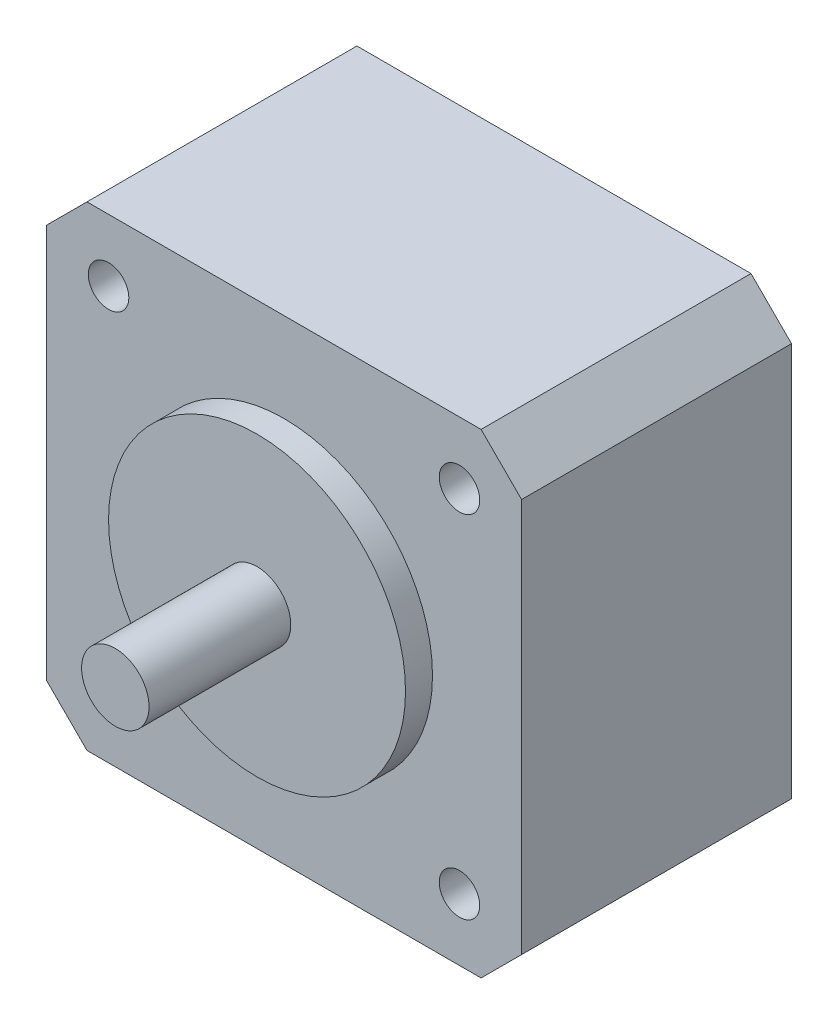
ISO-10303-21;
HEADER;
FILE_DESCRIPTION(('STEP AP214'),'2;1');
FILE_NAME('part.step','',(''),(''),'','','');
FILE_SCHEMA(('AUTOMOTIVE_DESIGN { 1 0 10303 214 1 1 1 1 }'));
ENDSEC;
DATA;
#1=APPLICATION_CONTEXT('core data for automotive mechanical design processes');
#2=APPLICATION_PROTOCOL_DEFINITION('international standard','automotive_design',2000,#1);
#3=PRODUCT_CONTEXT('',#1,'mechanical');
#4=PRODUCT('Part','Part','',(#3));
#5=PRODUCT_RELATED_PRODUCT_CATEGORY('part','',(#4));
#6=PRODUCT_DEFINITION_FORMATION('','',#4);
#7=PRODUCT_DEFINITION_CONTEXT('part definition',#1,'design');
#8=PRODUCT_DEFINITION('design','',#6,#7);
#9=PRODUCT_DEFINITION_SHAPE('','',#8);
#10=(LENGTH_UNIT() NAMED_UNIT(*) SI_UNIT(.MILLI.,.METRE.));
#11=(NAMED_UNIT(*) PLANE_ANGLE_UNIT() SI_UNIT($,.RADIAN.));
#12=(NAMED_UNIT(*) SI_UNIT($,.STERADIAN.) SOLID_ANGLE_UNIT());
#13=UNCERTAINTY_MEASURE_WITH_UNIT(LENGTH_MEASURE(1.E-05),#10,'distance_accuracy_value','');
#14=(GEOMETRIC_REPRESENTATION_CONTEXT(3) GLOBAL_UNCERTAINTY_ASSIGNED_CONTEXT((#13)) GLOBAL_UNIT_ASSIGNED_CONTEXT((#10,
#11,#12)) REPRESENTATION_CONTEXT('',''));
#15=CARTESIAN_POINT('',(0.,0.,0.));
#16=DIRECTION('',(0.,0.,1.));
#17=DIRECTION('',(1.,0.,0.));
#18=AXIS2_PLACEMENT_3D('',#15,#16,#17);
#19=CARTESIAN_POINT('',(17.6,17.6,20.));
#20=DIRECTION('',(-1.,0.,0.));
#21=DIRECTION('',(0.,0.,1.));
#22=AXIS2_PLACEMENT_3D('',#19,#20,#21);
#23=PLANE('',#22);
#24=DIRECTION('',(0.,1.,0.));
#25=VECTOR('',#24,1.);
#26=CARTESIAN_POINT('',(17.6,17.6,20.));
#27=LINE('',#26,#25);
#28=CARTESIAN_POINT('',(17.6,-14.6,20.));
#29=VERTEX_POINT('',#28);
#30=CARTESIAN_POINT('',(17.6,14.6,20.));
#31=VERTEX_POINT('',#30);
#32=EDGE_CURVE('E128',#29,#31,#27,.T.);
#33=ORIENTED_EDGE('',*,*,#32,.F.);
#34=DIRECTION('',(0.,0.,-1.));
#35=VECTOR('',#34,1.);
#36=CARTESIAN_POINT('',(17.6,-14.6,20.));
#37=LINE('',#36,#35);
#38=CARTESIAN_POINT('',(17.6,-14.6,0.));
#39=VERTEX_POINT('',#38);
#40=EDGE_CURVE('E11',#29,#39,#37,.T.);
#41=ORIENTED_EDGE('',*,*,#40,.T.);
#42=DIRECTION('',(0.,1.,0.));
#43=VECTOR('',#42,1.);
#44=CARTESIAN_POINT('',(17.6,17.6,0.));
#45=LINE('',#44,#43);
#46=CARTESIAN_POINT('',(17.6,14.6,0.));
#47=VERTEX_POINT('',#46);
#48=EDGE_CURVE('E160',#39,#47,#45,.T.);
#49=ORIENTED_EDGE('',*,*,#48,.T.);
#50=DIRECTION('',(0.,0.,1.));
#51=VECTOR('',#50,1.);
#52=CARTESIAN_POINT('',(17.6,14.6,20.));
#53=LINE('',#52,#51);
#54=EDGE_CURVE('E42',#47,#31,#53,.T.);
#55=ORIENTED_EDGE('',*,*,#54,.T.);
#56=EDGE_LOOP('',(#33,#41,#49,#55));
#57=FACE_BOUND('',#56,.T.);
#58=ADVANCED_FACE('F34',(#57),#23,.F.);
#59=CARTESIAN_POINT('',(-17.6,17.6,20.));
#60=DIRECTION('',(0.,-1.,0.));
#61=DIRECTION('',(0.,0.,-1.));
#62=AXIS2_PLACEMENT_3D('',#59,#60,#61);
#63=PLANE('',#62);
#64=DIRECTION('',(-1.,0.,0.));
#65=VECTOR('',#64,1.);
#66=CARTESIAN_POINT('',(-17.6,17.6,0.));
#67=LINE('',#66,#65);
#68=CARTESIAN_POINT('',(14.6,17.6,0.));
#69=VERTEX_POINT('',#68);
#70=CARTESIAN_POINT('',(-14.6,17.6,0.));
#71=VERTEX_POINT('',#70);
#72=EDGE_CURVE('E133',#69,#71,#67,.T.);
#73=ORIENTED_EDGE('',*,*,#72,.T.);
#74=DIRECTION('',(0.,0.,1.));
#75=VECTOR('',#74,1.);
#76=CARTESIAN_POINT('',(-14.6,17.6,20.));
#77=LINE('',#76,#75);
#78=CARTESIAN_POINT('',(-14.6,17.6,20.));
#79=VERTEX_POINT('',#78);
#80=EDGE_CURVE('E49',#71,#79,#77,.T.);
#81=ORIENTED_EDGE('',*,*,#80,.T.);
#82=DIRECTION('',(-1.,0.,0.));
#83=VECTOR('',#82,1.);
#84=CARTESIAN_POINT('',(-17.6,17.6,20.));
#85=LINE('',#84,#83);
#86=CARTESIAN_POINT('',(14.6,17.6,20.));
#87=VERTEX_POINT('',#86);
#88=EDGE_CURVE('E131',#87,#79,#85,.T.);
#89=ORIENTED_EDGE('',*,*,#88,.F.);
#90=DIRECTION('',(0.,0.,-1.));
#91=VECTOR('',#90,1.);
#92=CARTESIAN_POINT('',(14.6,17.6,20.));
#93=LINE('',#92,#91);
#94=EDGE_CURVE('E152',#87,#69,#93,.T.);
#95=ORIENTED_EDGE('',*,*,#94,.T.);
#96=EDGE_LOOP('',(#73,#81,#89,#95));
#97=FACE_BOUND('',#96,.T.);
#98=ADVANCED_FACE('F167',(#97),#63,.F.);
#99=CARTESIAN_POINT('',(-17.6,17.6,20.));
#100=DIRECTION('',(1.,0.,0.));
#101=DIRECTION('',(0.,1.,0.));
#102=AXIS2_PLACEMENT_3D('',#99,#100,#101);
#103=PLANE('',#102);
#104=DIRECTION('',(0.,-1.,0.));
#105=VECTOR('',#104,1.);
#106=CARTESIAN_POINT('',(-17.6,17.6,0.));
#107=LINE('',#106,#105);
#108=CARTESIAN_POINT('',(-17.6,14.6,0.));
#109=VERTEX_POINT('',#108);
#110=CARTESIAN_POINT('',(-17.6,-14.6,0.));
#111=VERTEX_POINT('',#110);
#112=EDGE_CURVE('E129',#109,#111,#107,.T.);
#113=ORIENTED_EDGE('',*,*,#112,.T.);
#114=DIRECTION('',(0.,0.,1.));
#115=VECTOR('',#114,1.);
#116=CARTESIAN_POINT('',(-17.6,-14.6,20.));
#117=LINE('',#116,#115);
#118=CARTESIAN_POINT('',(-17.6,-14.6,20.));
#119=VERTEX_POINT('',#118);
#120=EDGE_CURVE('E106',#111,#119,#117,.T.);
#121=ORIENTED_EDGE('',*,*,#120,.T.);
#122=DIRECTION('',(0.,-1.,0.));
#123=VECTOR('',#122,1.);
#124=CARTESIAN_POINT('',(-17.6,17.6,20.));
#125=LINE('',#124,#123);
#126=CARTESIAN_POINT('',(-17.6,14.6,20.));
#127=VERTEX_POINT('',#126);
#128=EDGE_CURVE('E173',#127,#119,#125,.T.);
#129=ORIENTED_EDGE('',*,*,#128,.F.);
#130=DIRECTION('',(0.,0.,-1.));
#131=VECTOR('',#130,1.);
#132=CARTESIAN_POINT('',(-17.6,14.6,20.));
#133=LINE('',#132,#131);
#134=EDGE_CURVE('E111',#127,#109,#133,.T.);
#135=ORIENTED_EDGE('',*,*,#134,.T.);
#136=EDGE_LOOP('',(#113,#121,#129,#135));
#137=FACE_BOUND('',#136,.T.);
#138=ADVANCED_FACE('F246',(#137),#103,.F.);
#139=CARTESIAN_POINT('',(-17.6,-17.6,20.));
#140=DIRECTION('',(0.,1.,0.));
#141=DIRECTION('',(0.,0.,1.));
#142=AXIS2_PLACEMENT_3D('',#139,#140,#141);
#143=PLANE('',#142);
#144=DIRECTION('',(1.,0.,0.));
#145=VECTOR('',#144,1.);
#146=CARTESIAN_POINT('',(-17.6,-17.6,20.));
#147=LINE('',#146,#145);
#148=CARTESIAN_POINT('',(-14.6,-17.6,20.));
#149=VERTEX_POINT('',#148);
#150=CARTESIAN_POINT('',(14.6,-17.6,20.));
#151=VERTEX_POINT('',#150);
#152=EDGE_CURVE('E121',#149,#151,#147,.T.);
#153=ORIENTED_EDGE('',*,*,#152,.F.);
#154=DIRECTION('',(0.,0.,-1.));
#155=VECTOR('',#154,1.);
#156=CARTESIAN_POINT('',(-14.6,-17.6,20.));
#157=LINE('',#156,#155);
#158=CARTESIAN_POINT('',(-14.6,-17.6,0.));
#159=VERTEX_POINT('',#158);
#160=EDGE_CURVE('E105',#149,#159,#157,.T.);
#161=ORIENTED_EDGE('',*,*,#160,.T.);
#162=DIRECTION('',(1.,0.,0.));
#163=VECTOR('',#162,1.);
#164=CARTESIAN_POINT('',(-17.6,-17.6,0.));
#165=LINE('',#164,#163);
#166=CARTESIAN_POINT('',(14.6,-17.6,0.));
#167=VERTEX_POINT('',#166);
#168=EDGE_CURVE('E118',#159,#167,#165,.T.);
#169=ORIENTED_EDGE('',*,*,#168,.T.);
#170=DIRECTION('',(0.,0.,1.));
#171=VECTOR('',#170,1.);
#172=CARTESIAN_POINT('',(14.6,-17.6,20.));
#173=LINE('',#172,#171);
#174=EDGE_CURVE('E123',#167,#151,#173,.T.);
#175=ORIENTED_EDGE('',*,*,#174,.T.);
#176=EDGE_LOOP('',(#153,#161,#169,#175));
#177=FACE_BOUND('',#176,.T.);
#178=ADVANCED_FACE('F117',(#177),#143,.F.);
#179=CARTESIAN_POINT('',(0.,0.,20.));
#180=DIRECTION('',(0.,0.,1.));
#181=DIRECTION('',(1.,0.,0.));
#182=AXIS2_PLACEMENT_3D('',#179,#180,#181);
#183=PLANE('',#182);
#184=CARTESIAN_POINT('',(-13.,13.,20.));
#185=DIRECTION('',(0.,0.,1.));
#186=DIRECTION('',(1.,0.,0.));
#187=AXIS2_PLACEMENT_3D('',#184,#185,#186);
#188=CIRCLE('',#187,1.5);
#189=CARTESIAN_POINT('',(-11.5,13.,20.));
#190=VERTEX_POINT('',#189);
#191=EDGE_CURVE('E192',#190,#190,#188,.T.);
#192=ORIENTED_EDGE('',*,*,#191,.F.);
#193=EDGE_LOOP('',(#192));
#194=FACE_BOUND('',#193,.T.);
#195=CARTESIAN_POINT('',(-13.,-13.,20.));
#196=DIRECTION('',(0.,0.,1.));
#197=DIRECTION('',(1.,0.,0.));
#198=AXIS2_PLACEMENT_3D('',#195,#196,#197);
#199=CIRCLE('',#198,1.5);
#200=CARTESIAN_POINT('',(-11.5,-13.,20.));
#201=VERTEX_POINT('',#200);
#202=EDGE_CURVE('E198',#201,#201,#199,.T.);
#203=ORIENTED_EDGE('',*,*,#202,.F.);
#204=EDGE_LOOP('',(#203));
#205=FACE_BOUND('',#204,.T.);
#206=CARTESIAN_POINT('',(13.,-13.,20.));
#207=DIRECTION('',(0.,0.,1.));
#208=DIRECTION('',(1.,0.,0.));
#209=AXIS2_PLACEMENT_3D('',#206,#207,#208);
#210=CIRCLE('',#209,1.5);
#211=CARTESIAN_POINT('',(14.5,-13.,20.));
#212=VERTEX_POINT('',#211);
#213=EDGE_CURVE('E204',#212,#212,#210,.T.);
#214=ORIENTED_EDGE('',*,*,#213,.F.);
#215=EDGE_LOOP('',(#214));
#216=FACE_BOUND('',#215,.T.);
#217=CARTESIAN_POINT('',(13.,13.,20.));
#218=DIRECTION('',(0.,0.,1.));
#219=DIRECTION('',(1.,0.,0.));
#220=AXIS2_PLACEMENT_3D('',#217,#218,#219);
#221=CIRCLE('',#220,1.5);
#222=CARTESIAN_POINT('',(14.5,13.,20.));
#223=VERTEX_POINT('',#222);
#224=EDGE_CURVE('E186',#223,#223,#221,.T.);
#225=ORIENTED_EDGE('',*,*,#224,.F.);
#226=EDGE_LOOP('',(#225));
#227=FACE_BOUND('',#226,.T.);
#228=CARTESIAN_POINT('',(0.,0.,20.));
#229=DIRECTION('',(0.,0.,1.));
#230=DIRECTION('',(1.,0.,0.));
#231=AXIS2_PLACEMENT_3D('',#228,#229,#230);
#232=CIRCLE('',#231,11.);
#233=CARTESIAN_POINT('',(11.,0.,20.));
#234=VERTEX_POINT('',#233);
#235=EDGE_CURVE('E172',#234,#234,#232,.T.);
#236=ORIENTED_EDGE('',*,*,#235,.F.);
#237=EDGE_LOOP('',(#236));
#238=FACE_BOUND('',#237,.T.);
#239=ORIENTED_EDGE('',*,*,#128,.T.);
#240=DIRECTION('',(-0.707106781186546,0.707106781186549,0.));
#241=VECTOR('',#240,1.);
#242=CARTESIAN_POINT('',(-16.1,-16.1,20.));
#243=LINE('',#242,#241);
#244=EDGE_CURVE('E150',#119,#149,#243,.F.);
#245=ORIENTED_EDGE('',*,*,#244,.T.);
#246=ORIENTED_EDGE('',*,*,#152,.T.);
#247=DIRECTION('',(-0.707106781186549,-0.707106781186546,0.));
#248=VECTOR('',#247,1.);
#249=CARTESIAN_POINT('',(16.1,-16.1,20.));
#250=LINE('',#249,#248);
#251=EDGE_CURVE('E146',#151,#29,#250,.F.);
#252=ORIENTED_EDGE('',*,*,#251,.T.);
#253=ORIENTED_EDGE('',*,*,#32,.T.);
#254=DIRECTION('',(0.707106781186546,-0.707106781186549,0.));
#255=VECTOR('',#254,1.);
#256=CARTESIAN_POINT('',(16.1,16.1,20.));
#257=LINE('',#256,#255);
#258=EDGE_CURVE('E56',#31,#87,#257,.F.);
#259=ORIENTED_EDGE('',*,*,#258,.T.);
#260=ORIENTED_EDGE('',*,*,#88,.T.);
#261=DIRECTION('',(0.707106781186549,0.707106781186546,0.));
#262=VECTOR('',#261,1.);
#263=CARTESIAN_POINT('',(-16.1,16.1,20.));
#264=LINE('',#263,#262);
#265=EDGE_CURVE('E148',#79,#127,#264,.F.);
#266=ORIENTED_EDGE('',*,*,#265,.T.);
#267=EDGE_LOOP('',(#239,#245,#246,#252,#253,#259,#260,#266));
#268=FACE_BOUND('',#267,.T.);
#269=ADVANCED_FACE('F163',(#194,#205,#216,#227,#238,#268),#183,.T.);
#270=CARTESIAN_POINT('',(0.,0.,0.));
#271=DIRECTION('',(0.,0.,1.));
#272=DIRECTION('',(1.,0.,0.));
#273=AXIS2_PLACEMENT_3D('',#270,#271,#272);
#274=PLANE('',#273);
#275=ORIENTED_EDGE('',*,*,#168,.F.);
#276=DIRECTION('',(0.707106781186546,-0.707106781186549,0.));
#277=VECTOR('',#276,1.);
#278=CARTESIAN_POINT('',(-14.6,-17.6,0.));
#279=LINE('',#278,#277);
#280=EDGE_CURVE('E101',#159,#111,#279,.F.);
#281=ORIENTED_EDGE('',*,*,#280,.T.);
#282=ORIENTED_EDGE('',*,*,#112,.F.);
#283=DIRECTION('',(-0.707106781186549,-0.707106781186546,0.));
#284=VECTOR('',#283,1.);
#285=CARTESIAN_POINT('',(-17.6,14.6,0.));
#286=LINE('',#285,#284);
#287=EDGE_CURVE('E112',#109,#71,#286,.F.);
#288=ORIENTED_EDGE('',*,*,#287,.T.);
#289=ORIENTED_EDGE('',*,*,#72,.F.);
#290=DIRECTION('',(-0.707106781186546,0.707106781186549,0.));
#291=VECTOR('',#290,1.);
#292=CARTESIAN_POINT('',(14.6,17.6,0.));
#293=LINE('',#292,#291);
#294=EDGE_CURVE('E122',#69,#47,#293,.F.);
#295=ORIENTED_EDGE('',*,*,#294,.T.);
#296=ORIENTED_EDGE('',*,*,#48,.F.);
#297=DIRECTION('',(0.707106781186549,0.707106781186546,0.));
#298=VECTOR('',#297,1.);
#299=CARTESIAN_POINT('',(17.6,-14.6,0.));
#300=LINE('',#299,#298);
#301=EDGE_CURVE('E127',#39,#167,#300,.F.);
#302=ORIENTED_EDGE('',*,*,#301,.T.);
#303=EDGE_LOOP('',(#275,#281,#282,#288,#289,#295,#296,#302));
#304=FACE_BOUND('',#303,.T.);
#305=ADVANCED_FACE('F125',(#304),#274,.F.);
#306=CARTESIAN_POINT('',(0.,0.,22.));
#307=DIRECTION('',(0.,0.,-1.));
#308=DIRECTION('',(-1.,0.,0.));
#309=AXIS2_PLACEMENT_3D('',#306,#307,#308);
#310=CYLINDRICAL_SURFACE('',#309,11.);
#311=CARTESIAN_POINT('',(0.,0.,22.));
#312=DIRECTION('',(0.,0.,1.));
#313=DIRECTION('',(1.,0.,0.));
#314=AXIS2_PLACEMENT_3D('',#311,#312,#313);
#315=CIRCLE('',#314,11.);
#316=CARTESIAN_POINT('',(11.,0.,22.));
#317=VERTEX_POINT('',#316);
#318=EDGE_CURVE('E168',#317,#317,#315,.T.);
#319=ORIENTED_EDGE('',*,*,#318,.F.);
#320=EDGE_LOOP('',(#319));
#321=FACE_BOUND('',#320,.T.);
#322=ORIENTED_EDGE('',*,*,#235,.T.);
#323=EDGE_LOOP('',(#322));
#324=FACE_BOUND('',#323,.T.);
#325=ADVANCED_FACE('F227',(#321,#324),#310,.T.);
#326=CARTESIAN_POINT('',(0.,0.,22.));
#327=DIRECTION('',(0.,0.,1.));
#328=DIRECTION('',(1.,0.,0.));
#329=AXIS2_PLACEMENT_3D('',#326,#327,#328);
#330=PLANE('',#329);
#331=CARTESIAN_POINT('',(0.,0.,22.));
#332=DIRECTION('',(0.,0.,1.));
#333=DIRECTION('',(1.,0.,0.));
#334=AXIS2_PLACEMENT_3D('',#331,#332,#333);
#335=CIRCLE('',#334,2.5);
#336=CARTESIAN_POINT('',(-2.5,0.,22.));
#337=VERTEX_POINT('',#336);
#338=EDGE_CURVE('E137',#337,#337,#335,.T.);
#339=ORIENTED_EDGE('',*,*,#338,.F.);
#340=EDGE_LOOP('',(#339));
#341=FACE_BOUND('',#340,.T.);
#342=ORIENTED_EDGE('',*,*,#318,.T.);
#343=EDGE_LOOP('',(#342));
#344=FACE_BOUND('',#343,.T.);
#345=ADVANCED_FACE('F229',(#341,#344),#330,.T.);
#346=CARTESIAN_POINT('',(0.,0.,32.5));
#347=DIRECTION('',(0.,0.,-1.));
#348=DIRECTION('',(-1.,0.,0.));
#349=AXIS2_PLACEMENT_3D('',#346,#347,#348);
#350=CYLINDRICAL_SURFACE('',#349,2.5);
#351=CARTESIAN_POINT('',(0.,0.,32.5));
#352=DIRECTION('',(0.,0.,1.));
#353=DIRECTION('',(1.,0.,0.));
#354=AXIS2_PLACEMENT_3D('',#351,#352,#353);
#355=CIRCLE('',#354,2.5);
#356=CARTESIAN_POINT('',(-2.5,0.,32.5));
#357=VERTEX_POINT('',#356);
#358=EDGE_CURVE('E180',#357,#357,#355,.T.);
#359=CARTESIAN_POINT('',(-2.5,0.,32.5));
#360=CARTESIAN_POINT('',(-2.5,0.,32.390625));
#361=CARTESIAN_POINT('',(-2.5,0.,32.28125));
#362=CARTESIAN_POINT('',(-2.5,0.,32.0625));
#363=CARTESIAN_POINT('',(-2.5,0.,31.953125));
#364=CARTESIAN_POINT('',(-2.5,0.,31.734375));
#365=CARTESIAN_POINT('',(-2.5,0.,31.625));
#366=CARTESIAN_POINT('',(-2.5,0.,31.40625));
#367=CARTESIAN_POINT('',(-2.5,0.,31.296875));
#368=CARTESIAN_POINT('',(-2.5,0.,31.078125));
#369=CARTESIAN_POINT('',(-2.5,0.,30.96875));
#370=CARTESIAN_POINT('',(-2.5,0.,30.75));
#371=CARTESIAN_POINT('',(-2.5,0.,30.640625));
#372=CARTESIAN_POINT('',(-2.5,0.,30.421875));
#373=CARTESIAN_POINT('',(-2.5,0.,30.3125));
#374=CARTESIAN_POINT('',(-2.5,0.,30.09375));
#375=CARTESIAN_POINT('',(-2.5,0.,29.984375));
#376=CARTESIAN_POINT('',(-2.5,0.,29.765625));
#377=CARTESIAN_POINT('',(-2.5,0.,29.65625));
#378=CARTESIAN_POINT('',(-2.5,0.,29.4375));
#379=CARTESIAN_POINT('',(-2.5,0.,29.328125));
#380=CARTESIAN_POINT('',(-2.5,0.,29.109375));
#381=CARTESIAN_POINT('',(-2.5,0.,29.));
#382=CARTESIAN_POINT('',(-2.5,0.,28.78125));
#383=CARTESIAN_POINT('',(-2.5,0.,28.671875));
#384=CARTESIAN_POINT('',(-2.5,0.,28.453125));
#385=CARTESIAN_POINT('',(-2.5,0.,28.34375));
#386=CARTESIAN_POINT('',(-2.5,0.,28.125));
#387=CARTESIAN_POINT('',(-2.5,0.,28.015625));
#388=CARTESIAN_POINT('',(-2.5,0.,27.796875));
#389=CARTESIAN_POINT('',(-2.5,0.,27.6875));
#390=CARTESIAN_POINT('',(-2.5,0.,27.46875));
#391=CARTESIAN_POINT('',(-2.5,0.,27.359375));
#392=CARTESIAN_POINT('',(-2.5,0.,27.140625));
#393=CARTESIAN_POINT('',(-2.5,0.,27.03125));
#394=CARTESIAN_POINT('',(-2.5,0.,26.8125));
#395=CARTESIAN_POINT('',(-2.5,0.,26.703125));
#396=CARTESIAN_POINT('',(-2.5,0.,26.484375));
#397=CARTESIAN_POINT('',(-2.5,0.,26.375));
#398=CARTESIAN_POINT('',(-2.5,0.,26.15625));
#399=CARTESIAN_POINT('',(-2.5,0.,26.046875));
#400=CARTESIAN_POINT('',(-2.5,0.,25.828125));
#401=CARTESIAN_POINT('',(-2.5,0.,25.71875));
#402=CARTESIAN_POINT('',(-2.5,0.,25.5));
#403=CARTESIAN_POINT('',(-2.5,0.,25.390625));
#404=CARTESIAN_POINT('',(-2.5,0.,25.171875));
#405=CARTESIAN_POINT('',(-2.5,0.,25.0625));
#406=CARTESIAN_POINT('',(-2.5,0.,24.84375));
#407=CARTESIAN_POINT('',(-2.5,0.,24.734375));
#408=CARTESIAN_POINT('',(-2.5,0.,24.515625));
#409=CARTESIAN_POINT('',(-2.5,0.,24.40625));
#410=CARTESIAN_POINT('',(-2.5,0.,24.1875));
#411=CARTESIAN_POINT('',(-2.5,0.,24.078125));
#412=CARTESIAN_POINT('',(-2.5,0.,23.859375));
#413=CARTESIAN_POINT('',(-2.5,0.,23.75));
#414=CARTESIAN_POINT('',(-2.5,0.,23.53125));
#415=CARTESIAN_POINT('',(-2.5,0.,23.421875));
#416=CARTESIAN_POINT('',(-2.5,0.,23.203125));
#417=CARTESIAN_POINT('',(-2.5,0.,23.09375));
#418=CARTESIAN_POINT('',(-2.5,0.,22.875));
#419=CARTESIAN_POINT('',(-2.5,0.,22.765625));
#420=CARTESIAN_POINT('',(-2.5,0.,22.546875));
#421=CARTESIAN_POINT('',(-2.5,0.,22.4375));
#422=CARTESIAN_POINT('',(-2.5,0.,22.21875));
#423=CARTESIAN_POINT('',(-2.5,0.,22.109375));
#424=CARTESIAN_POINT('',(-2.5,0.,22.));
#425=B_SPLINE_CURVE_WITH_KNOTS('',3,(#359,#360,#361,#362,#363,#364,#365,#366,#367,#368,#369,
#370,#371,#372,#373,#374,#375,#376,#377,#378,#379,#380,#381,#382,#383,#384,#385,#386,#387,#388,
#389,#390,#391,#392,#393,#394,#395,#396,#397,#398,#399,#400,#401,#402,#403,#404,#405,#406,#407,
#408,#409,#410,#411,#412,#413,#414,#415,#416,#417,#418,#419,#420,#421,#422,#423,#424),
.UNSPECIFIED.,.F.,.F.,(4,2,2,2,2,2,2,2,2,2,2,2,2,2,2,2,2,2,2,2,2,2,2,2,2,2,2,2,2,2,2,2,4),(0.,
0.328125000000005,0.656250000000004,0.984375000000003,1.3125,1.640625,1.96875000000001,2.296875,
2.625,2.953125,3.28125,3.609375,3.9375,4.265625,4.59375,4.921875,5.25,5.578125,5.90625000000001,
6.234375,6.56250000000001,6.890625,7.21875,7.54687500000001,7.875,8.20312500000001,8.53125,
8.859375,9.1875,9.515625,9.84375000000001,10.171875,10.5),.UNSPECIFIED.);
#426=EDGE_CURVE('BSEAM236',#357,#337,#425,.T.);
#427=ORIENTED_EDGE('',*,*,#358,.F.);
#428=ORIENTED_EDGE('',*,*,#338,.T.);
#429=ORIENTED_EDGE('',*,*,#426,.T.);
#430=ORIENTED_EDGE('',*,*,#426,.F.);
#431=EDGE_LOOP('',(#427,#429,#428,#430));
#432=FACE_BOUND('',#431,.T.);
#433=ADVANCED_FACE('F236',(#432),#350,.T.);
#434=CARTESIAN_POINT('',(0.,0.,32.5));
#435=DIRECTION('',(0.,0.,1.));
#436=DIRECTION('',(1.,0.,0.));
#437=AXIS2_PLACEMENT_3D('',#434,#435,#436);
#438=PLANE('',#437);
#439=ORIENTED_EDGE('',*,*,#358,.T.);
#440=EDGE_LOOP('',(#439));
#441=FACE_BOUND('',#440,.T.);
#442=ADVANCED_FACE('F361',(#441),#438,.T.);
#443=CARTESIAN_POINT('',(13.,13.,15.5));
#444=DIRECTION('',(0.,0.,1.));
#445=DIRECTION('',(1.,0.,0.));
#446=AXIS2_PLACEMENT_3D('',#443,#444,#445);
#447=CYLINDRICAL_SURFACE('',#446,1.5);
#448=CARTESIAN_POINT('',(13.,13.,15.5));
#449=DIRECTION('',(0.,0.,1.));
#450=DIRECTION('',(1.,0.,0.));
#451=AXIS2_PLACEMENT_3D('',#448,#449,#450);
#452=CIRCLE('',#451,1.5);
#453=CARTESIAN_POINT('',(14.5,13.,15.5));
#454=VERTEX_POINT('',#453);
#455=EDGE_CURVE('E185',#454,#454,#452,.T.);
#456=ORIENTED_EDGE('',*,*,#455,.F.);
#457=EDGE_LOOP('',(#456));
#458=FACE_BOUND('',#457,.T.);
#459=ORIENTED_EDGE('',*,*,#224,.T.);
#460=EDGE_LOOP('',(#459));
#461=FACE_BOUND('',#460,.T.);
#462=ADVANCED_FACE('F353',(#458,#461),#447,.F.);
#463=CARTESIAN_POINT('',(13.,13.,15.5));
#464=DIRECTION('',(0.,0.,1.));
#465=DIRECTION('',(1.,0.,0.));
#466=AXIS2_PLACEMENT_3D('',#463,#464,#465);
#467=PLANE('',#466);
#468=ORIENTED_EDGE('',*,*,#455,.T.);
#469=EDGE_LOOP('',(#468));
#470=FACE_BOUND('',#469,.T.);
#471=ADVANCED_FACE('F215',(#470),#467,.T.);
#472=CARTESIAN_POINT('',(13.,-13.,15.5));
#473=DIRECTION('',(0.,0.,1.));
#474=DIRECTION('',(1.,0.,0.));
#475=AXIS2_PLACEMENT_3D('',#472,#473,#474);
#476=CYLINDRICAL_SURFACE('',#475,1.5);
#477=CARTESIAN_POINT('',(13.,-13.,15.5));
#478=DIRECTION('',(0.,0.,1.));
#479=DIRECTION('',(1.,0.,0.));
#480=AXIS2_PLACEMENT_3D('',#477,#478,#479);
#481=CIRCLE('',#480,1.5);
#482=CARTESIAN_POINT('',(14.5,-13.,15.5));
#483=VERTEX_POINT('',#482);
#484=EDGE_CURVE('E189',#483,#483,#481,.T.);
#485=ORIENTED_EDGE('',*,*,#484,.F.);
#486=EDGE_LOOP('',(#485));
#487=FACE_BOUND('',#486,.T.);
#488=ORIENTED_EDGE('',*,*,#213,.T.);
#489=EDGE_LOOP('',(#488));
#490=FACE_BOUND('',#489,.T.);
#491=ADVANCED_FACE('F212',(#487,#490),#476,.F.);
#492=CARTESIAN_POINT('',(13.,-13.,15.5));
#493=DIRECTION('',(0.,0.,1.));
#494=DIRECTION('',(1.,0.,0.));
#495=AXIS2_PLACEMENT_3D('',#492,#493,#494);
#496=PLANE('',#495);
#497=ORIENTED_EDGE('',*,*,#484,.T.);
#498=EDGE_LOOP('',(#497));
#499=FACE_BOUND('',#498,.T.);
#500=ADVANCED_FACE('F210',(#499),#496,.T.);
#501=CARTESIAN_POINT('',(-13.,-13.,15.5));
#502=DIRECTION('',(0.,0.,1.));
#503=DIRECTION('',(1.,0.,0.));
#504=AXIS2_PLACEMENT_3D('',#501,#502,#503);
#505=CYLINDRICAL_SURFACE('',#504,1.5);
#506=CARTESIAN_POINT('',(-13.,-13.,15.5));
#507=DIRECTION('',(0.,0.,1.));
#508=DIRECTION('',(1.,0.,0.));
#509=AXIS2_PLACEMENT_3D('',#506,#507,#508);
#510=CIRCLE('',#509,1.5);
#511=CARTESIAN_POINT('',(-11.5,-13.,15.5));
#512=VERTEX_POINT('',#511);
#513=EDGE_CURVE('E201',#512,#512,#510,.T.);
#514=ORIENTED_EDGE('',*,*,#513,.F.);
#515=EDGE_LOOP('',(#514));
#516=FACE_BOUND('',#515,.T.);
#517=ORIENTED_EDGE('',*,*,#202,.T.);
#518=EDGE_LOOP('',(#517));
#519=FACE_BOUND('',#518,.T.);
#520=ADVANCED_FACE('F328',(#516,#519),#505,.F.);
#521=CARTESIAN_POINT('',(-13.,-13.,15.5));
#522=DIRECTION('',(0.,0.,1.));
#523=DIRECTION('',(1.,0.,0.));
#524=AXIS2_PLACEMENT_3D('',#521,#522,#523);
#525=PLANE('',#524);
#526=ORIENTED_EDGE('',*,*,#513,.T.);
#527=EDGE_LOOP('',(#526));
#528=FACE_BOUND('',#527,.T.);
#529=ADVANCED_FACE('F320',(#528),#525,.T.);
#530=CARTESIAN_POINT('',(-13.,13.,15.5));
#531=DIRECTION('',(0.,0.,1.));
#532=DIRECTION('',(1.,0.,0.));
#533=AXIS2_PLACEMENT_3D('',#530,#531,#532);
#534=CYLINDRICAL_SURFACE('',#533,1.5);
#535=CARTESIAN_POINT('',(-13.,13.,15.5));
#536=DIRECTION('',(0.,0.,1.));
#537=DIRECTION('',(1.,0.,0.));
#538=AXIS2_PLACEMENT_3D('',#535,#536,#537);
#539=CIRCLE('',#538,1.5);
#540=CARTESIAN_POINT('',(-11.5,13.,15.5));
#541=VERTEX_POINT('',#540);
#542=EDGE_CURVE('E195',#541,#541,#539,.T.);
#543=ORIENTED_EDGE('',*,*,#542,.F.);
#544=EDGE_LOOP('',(#543));
#545=FACE_BOUND('',#544,.T.);
#546=ORIENTED_EDGE('',*,*,#191,.T.);
#547=EDGE_LOOP('',(#546));
#548=FACE_BOUND('',#547,.T.);
#549=ADVANCED_FACE('F313',(#545,#548),#534,.F.);
#550=CARTESIAN_POINT('',(-13.,13.,15.5));
#551=DIRECTION('',(0.,0.,1.));
#552=DIRECTION('',(1.,0.,0.));
#553=AXIS2_PLACEMENT_3D('',#550,#551,#552);
#554=PLANE('',#553);
#555=ORIENTED_EDGE('',*,*,#542,.T.);
#556=EDGE_LOOP('',(#555));
#557=FACE_BOUND('',#556,.T.);
#558=ADVANCED_FACE('F253',(#557),#554,.T.);
#559=CARTESIAN_POINT('',(-14.6,-17.6,20.));
#560=DIRECTION('',(0.707106781186549,0.707106781186546,0.));
#561=DIRECTION('',(0.,0.,-1.));
#562=AXIS2_PLACEMENT_3D('',#559,#560,#561);
#563=PLANE('',#562);
#564=ORIENTED_EDGE('',*,*,#244,.F.);
#565=ORIENTED_EDGE('',*,*,#120,.F.);
#566=ORIENTED_EDGE('',*,*,#280,.F.);
#567=ORIENTED_EDGE('',*,*,#160,.F.);
#568=EDGE_LOOP('',(#564,#565,#566,#567));
#569=FACE_BOUND('',#568,.T.);
#570=ADVANCED_FACE('F104',(#569),#563,.F.);
#571=CARTESIAN_POINT('',(-17.6,14.6,20.));
#572=DIRECTION('',(0.707106781186546,-0.707106781186549,0.));
#573=DIRECTION('',(0.,0.,-1.));
#574=AXIS2_PLACEMENT_3D('',#571,#572,#573);
#575=PLANE('',#574);
#576=ORIENTED_EDGE('',*,*,#265,.F.);
#577=ORIENTED_EDGE('',*,*,#80,.F.);
#578=ORIENTED_EDGE('',*,*,#287,.F.);
#579=ORIENTED_EDGE('',*,*,#134,.F.);
#580=EDGE_LOOP('',(#576,#577,#578,#579));
#581=FACE_BOUND('',#580,.T.);
#582=ADVANCED_FACE('F252',(#581),#575,.F.);
#583=CARTESIAN_POINT('',(17.6,-14.6,20.));
#584=DIRECTION('',(-0.707106781186546,0.707106781186549,0.));
#585=DIRECTION('',(0.,0.,-1.));
#586=AXIS2_PLACEMENT_3D('',#583,#584,#585);
#587=PLANE('',#586);
#588=ORIENTED_EDGE('',*,*,#251,.F.);
#589=ORIENTED_EDGE('',*,*,#174,.F.);
#590=ORIENTED_EDGE('',*,*,#301,.F.);
#591=ORIENTED_EDGE('',*,*,#40,.F.);
#592=EDGE_LOOP('',(#588,#589,#590,#591));
#593=FACE_BOUND('',#592,.T.);
#594=ADVANCED_FACE('F255',(#593),#587,.F.);
#595=CARTESIAN_POINT('',(14.6,17.6,20.));
#596=DIRECTION('',(-0.707106781186549,-0.707106781186546,0.));
#597=DIRECTION('',(0.,0.,-1.));
#598=AXIS2_PLACEMENT_3D('',#595,#596,#597);
#599=PLANE('',#598);
#600=ORIENTED_EDGE('',*,*,#258,.F.);
#601=ORIENTED_EDGE('',*,*,#54,.F.);
#602=ORIENTED_EDGE('',*,*,#294,.F.);
#603=ORIENTED_EDGE('',*,*,#94,.F.);
#604=EDGE_LOOP('',(#600,#601,#602,#603));
#605=FACE_BOUND('',#604,.T.);
#606=ADVANCED_FACE('F36',(#605),#599,.F.);
#607=CLOSED_SHELL('',(#58,#98,#138,#178,#269,#305,#325,#345,#433,#442,#462,#471,#491,#500,#520,
#529,#549,#558,#570,#582,#594,#606));
#608=MANIFOLD_SOLID_BREP('B2',#607);
#609=ADVANCED_BREP_SHAPE_REPRESENTATION('',(#18,#608),#14);
#610=SHAPE_DEFINITION_REPRESENTATION(#9,#609);
ENDSEC;
END-ISO-10303-21;
